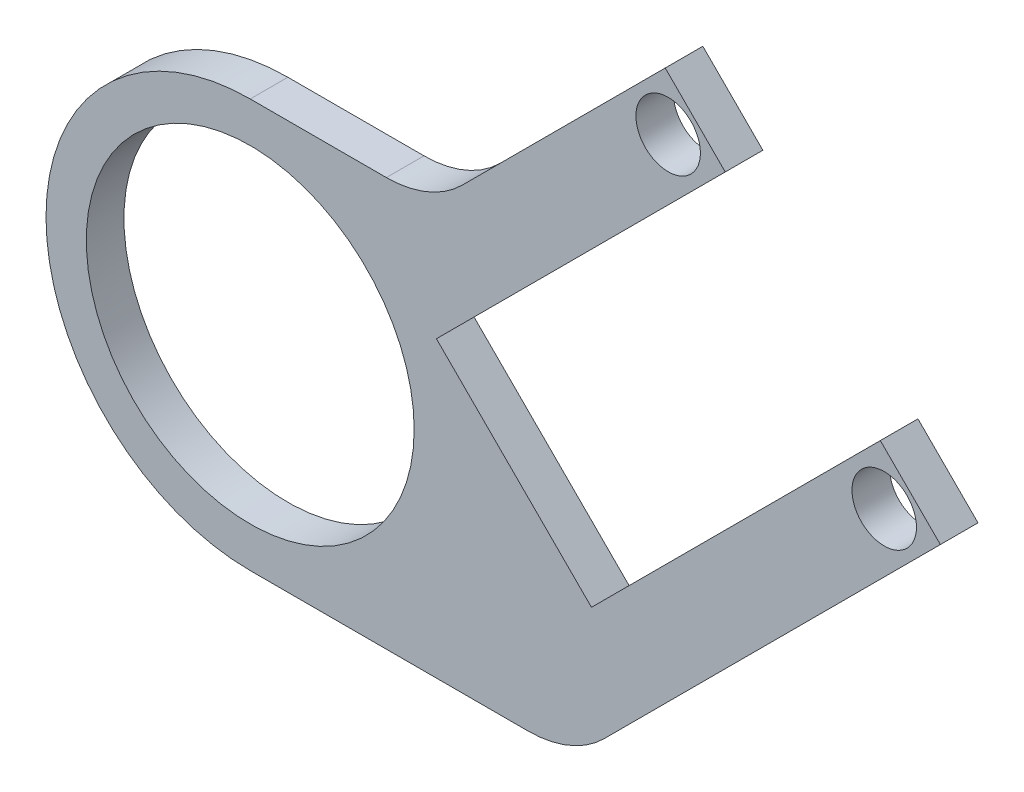
ISO-10303-21;
HEADER;
FILE_DESCRIPTION(('STEP AP214'),'2;1');
FILE_NAME('part.step','',(''),(''),'','','');
FILE_SCHEMA(('AUTOMOTIVE_DESIGN { 1 0 10303 214 1 1 1 1 }'));
ENDSEC;
DATA;
#1=APPLICATION_CONTEXT('core data for automotive mechanical design processes');
#2=APPLICATION_PROTOCOL_DEFINITION('international standard','automotive_design',2000,#1);
#3=PRODUCT_CONTEXT('',#1,'mechanical');
#4=PRODUCT('Part','Part','',(#3));
#5=PRODUCT_RELATED_PRODUCT_CATEGORY('part','',(#4));
#6=PRODUCT_DEFINITION_FORMATION('','',#4);
#7=PRODUCT_DEFINITION_CONTEXT('part definition',#1,'design');
#8=PRODUCT_DEFINITION('design','',#6,#7);
#9=PRODUCT_DEFINITION_SHAPE('','',#8);
#10=(LENGTH_UNIT() NAMED_UNIT(*) SI_UNIT(.MILLI.,.METRE.));
#11=(NAMED_UNIT(*) PLANE_ANGLE_UNIT() SI_UNIT($,.RADIAN.));
#12=(NAMED_UNIT(*) SI_UNIT($,.STERADIAN.) SOLID_ANGLE_UNIT());
#13=UNCERTAINTY_MEASURE_WITH_UNIT(LENGTH_MEASURE(1.E-05),#10,'distance_accuracy_value','');
#14=(GEOMETRIC_REPRESENTATION_CONTEXT(3) GLOBAL_UNCERTAINTY_ASSIGNED_CONTEXT((#13)) GLOBAL_UNIT_ASSIGNED_CONTEXT((#10,
#11,#12)) REPRESENTATION_CONTEXT('',''));
#15=CARTESIAN_POINT('',(0.,0.,0.));
#16=DIRECTION('',(0.,0.,1.));
#17=DIRECTION('',(1.,0.,0.));
#18=AXIS2_PLACEMENT_3D('',#15,#16,#17);
#19=CARTESIAN_POINT('',(0.,0.,3.5));
#20=DIRECTION('',(0.,0.,1.));
#21=DIRECTION('',(1.,0.,0.));
#22=AXIS2_PLACEMENT_3D('',#19,#20,#21);
#23=PLANE('',#22);
#24=CARTESIAN_POINT('',(58.9776159145091,15.4753711382337,3.5));
#25=DIRECTION('',(0.,0.,1.));
#26=DIRECTION('',(1.,0.,0.));
#27=AXIS2_PLACEMENT_3D('',#24,#25,#26);
#28=CIRCLE('',#27,3.);
#29=CARTESIAN_POINT('',(61.9776159145091,15.4753711382337,3.5));
#30=VERTEX_POINT('',#29);
#31=EDGE_CURVE('E289',#30,#30,#28,.T.);
#32=ORIENTED_EDGE('',*,*,#31,.F.);
#33=EDGE_LOOP('',(#32));
#34=FACE_BOUND('',#33,.T.);
#35=CARTESIAN_POINT('',(38.8781056592815,35.5748813934614,3.5));
#36=DIRECTION('',(0.,0.,1.));
#37=DIRECTION('',(1.,0.,0.));
#38=AXIS2_PLACEMENT_3D('',#35,#36,#37);
#39=CIRCLE('',#38,3.);
#40=CARTESIAN_POINT('',(41.8781056592815,35.5748813934614,3.5));
#41=VERTEX_POINT('',#40);
#42=EDGE_CURVE('E291',#41,#41,#39,.T.);
#43=ORIENTED_EDGE('',*,*,#42,.F.);
#44=EDGE_LOOP('',(#43));
#45=FACE_BOUND('',#44,.T.);
#46=CARTESIAN_POINT('',(0.,0.,3.5));
#47=DIRECTION('',(0.,0.,1.));
#48=DIRECTION('',(1.,0.,0.));
#49=AXIS2_PLACEMENT_3D('',#46,#47,#48);
#50=CIRCLE('',#49,15.25);
#51=CARTESIAN_POINT('',(15.25,0.,3.5));
#52=VERTEX_POINT('',#51);
#53=EDGE_CURVE('E297',#52,#52,#50,.T.);
#54=ORIENTED_EDGE('',*,*,#53,.F.);
#55=EDGE_LOOP('',(#54));
#56=FACE_BOUND('',#55,.T.);
#57=DIRECTION('',(1.,0.,0.));
#58=VECTOR('',#57,1.);
#59=CARTESIAN_POINT('',(0.,-19.,3.5));
#60=LINE('',#59,#58);
#61=CARTESIAN_POINT('',(0.,-19.,3.5));
#62=VERTEX_POINT('',#61);
#63=CARTESIAN_POINT('',(25.857864376269,-18.9999999999997,3.5));
#64=VERTEX_POINT('',#63);
#65=EDGE_CURVE('E189',#62,#64,#60,.T.);
#66=ORIENTED_EDGE('',*,*,#65,.T.);
#67=CARTESIAN_POINT('',(25.8578643762689,-8.99999999999968,3.5));
#68=DIRECTION('',(0.,0.,1.));
#69=DIRECTION('',(1.,0.,0.));
#70=AXIS2_PLACEMENT_3D('',#67,#68,#69);
#71=CIRCLE('',#70,10.);
#72=CARTESIAN_POINT('',(32.9289321881341,-16.0710678118654,3.5));
#73=VERTEX_POINT('',#72);
#74=EDGE_CURVE('E163',#64,#73,#71,.T.);
#75=ORIENTED_EDGE('',*,*,#74,.T.);
#76=DIRECTION('',(0.707106781186574,0.707106781186521,0.));
#77=VECTOR('',#76,1.);
#78=CARTESIAN_POINT('',(29.9999999999996,-18.9999999999996,3.5));
#79=LINE('',#78,#77);
#80=CARTESIAN_POINT('',(64.2013672605249,15.201367260523,3.5));
#81=VERTEX_POINT('',#80);
#82=EDGE_CURVE('E194',#73,#81,#79,.T.);
#83=ORIENTED_EDGE('',*,*,#82,.T.);
#84=DIRECTION('',(-0.707106781186531,0.707106781186563,0.));
#85=VECTOR('',#84,1.);
#86=CARTESIAN_POINT('',(64.2013672605249,15.201367260523,3.5));
#87=LINE('',#86,#85);
#88=CARTESIAN_POINT('',(58.6152236891513,20.7875108318968,3.5));
#89=VERTEX_POINT('',#88);
#90=EDGE_CURVE('E196',#81,#89,#87,.T.);
#91=ORIENTED_EDGE('',*,*,#90,.T.);
#92=DIRECTION('',(-0.707106781186562,-0.707106781186533,0.));
#93=VECTOR('',#92,1.);
#94=CARTESIAN_POINT('',(31.745166004062,-6.08254685319135,3.5));
#95=LINE('',#94,#93);
#96=CARTESIAN_POINT('',(31.745166004062,-6.08254685319135,3.5));
#97=VERTEX_POINT('',#96);
#98=EDGE_CURVE('E198',#89,#97,#95,.T.);
#99=ORIENTED_EDGE('',*,*,#98,.T.);
#100=DIRECTION('',(-0.707106781186544,0.707106781186551,0.));
#101=VECTOR('',#100,1.);
#102=CARTESIAN_POINT('',(17.3201876678565,8.34243148301427,3.5));
#103=LINE('',#102,#101);
#104=CARTESIAN_POINT('',(17.3201876678565,8.34243148301427,3.5));
#105=VERTEX_POINT('',#104);
#106=EDGE_CURVE('E139',#97,#105,#103,.T.);
#107=ORIENTED_EDGE('',*,*,#106,.T.);
#108=DIRECTION('',(0.707106781186562,0.707106781186533,0.));
#109=VECTOR('',#108,1.);
#110=CARTESIAN_POINT('',(17.3201876678565,8.34243148301427,3.5));
#111=LINE('',#110,#109);
#112=CARTESIAN_POINT('',(44.190245352946,35.2124891681027,3.5));
#113=VERTEX_POINT('',#112);
#114=EDGE_CURVE('E135',#105,#113,#111,.T.);
#115=ORIENTED_EDGE('',*,*,#114,.T.);
#116=DIRECTION('',(-0.707106781186533,0.707106781186562,0.));
#117=VECTOR('',#116,1.);
#118=CARTESIAN_POINT('',(44.190245352946,35.2124891681027,3.5));
#119=LINE('',#118,#117);
#120=CARTESIAN_POINT('',(38.6041017815724,40.7986327394765,3.5));
#121=VERTEX_POINT('',#120);
#122=EDGE_CURVE('E123',#113,#121,#119,.T.);
#123=ORIENTED_EDGE('',*,*,#122,.T.);
#124=DIRECTION('',(-0.707106781186543,-0.707106781186552,0.));
#125=VECTOR('',#124,1.);
#126=CARTESIAN_POINT('',(38.6041017815724,40.7986327394765,3.5));
#127=LINE('',#126,#125);
#128=CARTESIAN_POINT('',(19.7344012302307,21.9289321881346,3.5));
#129=VERTEX_POINT('',#128);
#130=EDGE_CURVE('E134',#121,#129,#127,.T.);
#131=ORIENTED_EDGE('',*,*,#130,.T.);
#132=CARTESIAN_POINT('',(12.6633334183652,29.,3.5));
#133=DIRECTION('',(0.,0.,1.));
#134=DIRECTION('',(1.,0.,0.));
#135=AXIS2_PLACEMENT_3D('',#132,#133,#134);
#136=CIRCLE('',#135,10.);
#137=CARTESIAN_POINT('',(12.6633334183652,19.,3.5));
#138=VERTEX_POINT('',#137);
#139=EDGE_CURVE('E11',#129,#138,#136,.F.);
#140=ORIENTED_EDGE('',*,*,#139,.T.);
#141=DIRECTION('',(-1.,0.,0.));
#142=VECTOR('',#141,1.);
#143=CARTESIAN_POINT('',(16.8054690420962,19.,3.5));
#144=LINE('',#143,#142);
#145=CARTESIAN_POINT('',(0.,19.,3.5));
#146=VERTEX_POINT('',#145);
#147=EDGE_CURVE('E181',#138,#146,#144,.T.);
#148=ORIENTED_EDGE('',*,*,#147,.T.);
#149=CARTESIAN_POINT('',(0.,0.,3.5));
#150=DIRECTION('',(0.,0.,1.));
#151=DIRECTION('',(1.,0.,0.));
#152=AXIS2_PLACEMENT_3D('',#149,#150,#151);
#153=CIRCLE('',#152,19.);
#154=EDGE_CURVE('E187',#146,#62,#153,.T.);
#155=ORIENTED_EDGE('',*,*,#154,.T.);
#156=EDGE_LOOP('',(#66,#75,#83,#91,#99,#107,#115,#123,#131,#140,#148,#155));
#157=FACE_BOUND('',#156,.T.);
#158=ADVANCED_FACE('F33',(#34,#45,#56,#157),#23,.T.);
#159=CARTESIAN_POINT('',(0.,0.,0.));
#160=DIRECTION('',(0.,0.,1.));
#161=DIRECTION('',(1.,0.,0.));
#162=AXIS2_PLACEMENT_3D('',#159,#160,#161);
#163=PLANE('',#162);
#164=CARTESIAN_POINT('',(58.9776159145091,15.4753711382337,0.));
#165=DIRECTION('',(0.,0.,1.));
#166=DIRECTION('',(1.,0.,0.));
#167=AXIS2_PLACEMENT_3D('',#164,#165,#166);
#168=CIRCLE('',#167,3.);
#169=CARTESIAN_POINT('',(61.9776159145091,15.4753711382337,0.));
#170=VERTEX_POINT('',#169);
#171=EDGE_CURVE('E287',#170,#170,#168,.T.);
#172=ORIENTED_EDGE('',*,*,#171,.T.);
#173=EDGE_LOOP('',(#172));
#174=FACE_BOUND('',#173,.T.);
#175=CARTESIAN_POINT('',(38.8781056592815,35.5748813934614,0.));
#176=DIRECTION('',(0.,0.,1.));
#177=DIRECTION('',(1.,0.,0.));
#178=AXIS2_PLACEMENT_3D('',#175,#176,#177);
#179=CIRCLE('',#178,3.);
#180=CARTESIAN_POINT('',(41.8781056592815,35.5748813934614,0.));
#181=VERTEX_POINT('',#180);
#182=EDGE_CURVE('E294',#181,#181,#179,.T.);
#183=ORIENTED_EDGE('',*,*,#182,.T.);
#184=EDGE_LOOP('',(#183));
#185=FACE_BOUND('',#184,.T.);
#186=CARTESIAN_POINT('',(0.,0.,0.));
#187=DIRECTION('',(0.,0.,1.));
#188=DIRECTION('',(1.,0.,0.));
#189=AXIS2_PLACEMENT_3D('',#186,#187,#188);
#190=CIRCLE('',#189,15.25);
#191=CARTESIAN_POINT('',(15.25,0.,0.));
#192=VERTEX_POINT('',#191);
#193=EDGE_CURVE('E203',#192,#192,#190,.T.);
#194=ORIENTED_EDGE('',*,*,#193,.T.);
#195=EDGE_LOOP('',(#194));
#196=FACE_BOUND('',#195,.T.);
#197=DIRECTION('',(0.707106781186574,0.707106781186521,0.));
#198=VECTOR('',#197,1.);
#199=CARTESIAN_POINT('',(29.9999999999996,-18.9999999999996,0.));
#200=LINE('',#199,#198);
#201=CARTESIAN_POINT('',(32.9289321881341,-16.0710678118654,0.));
#202=VERTEX_POINT('',#201);
#203=CARTESIAN_POINT('',(64.2013672605249,15.201367260523,0.));
#204=VERTEX_POINT('',#203);
#205=EDGE_CURVE('E210',#202,#204,#200,.T.);
#206=ORIENTED_EDGE('',*,*,#205,.F.);
#207=CARTESIAN_POINT('',(25.8578643762689,-8.99999999999968,0.));
#208=DIRECTION('',(0.,0.,1.));
#209=DIRECTION('',(1.,0.,0.));
#210=AXIS2_PLACEMENT_3D('',#207,#208,#209);
#211=CIRCLE('',#210,10.);
#212=CARTESIAN_POINT('',(25.857864376269,-18.9999999999997,0.));
#213=VERTEX_POINT('',#212);
#214=EDGE_CURVE('E56',#202,#213,#211,.F.);
#215=ORIENTED_EDGE('',*,*,#214,.T.);
#216=DIRECTION('',(1.,0.,0.));
#217=VECTOR('',#216,1.);
#218=CARTESIAN_POINT('',(0.,-19.,0.));
#219=LINE('',#218,#217);
#220=CARTESIAN_POINT('',(0.,-19.,0.));
#221=VERTEX_POINT('',#220);
#222=EDGE_CURVE('E208',#221,#213,#219,.T.);
#223=ORIENTED_EDGE('',*,*,#222,.F.);
#224=CARTESIAN_POINT('',(0.,0.,0.));
#225=DIRECTION('',(0.,0.,1.));
#226=DIRECTION('',(1.,0.,0.));
#227=AXIS2_PLACEMENT_3D('',#224,#225,#226);
#228=CIRCLE('',#227,19.);
#229=CARTESIAN_POINT('',(0.,19.,0.));
#230=VERTEX_POINT('',#229);
#231=EDGE_CURVE('E206',#230,#221,#228,.T.);
#232=ORIENTED_EDGE('',*,*,#231,.F.);
#233=DIRECTION('',(-1.,0.,0.));
#234=VECTOR('',#233,1.);
#235=CARTESIAN_POINT('',(16.8054690420962,19.,0.));
#236=LINE('',#235,#234);
#237=CARTESIAN_POINT('',(12.6633334183652,19.,0.));
#238=VERTEX_POINT('',#237);
#239=EDGE_CURVE('E170',#238,#230,#236,.T.);
#240=ORIENTED_EDGE('',*,*,#239,.F.);
#241=CARTESIAN_POINT('',(12.6633334183652,29.,0.));
#242=DIRECTION('',(0.,0.,1.));
#243=DIRECTION('',(1.,0.,0.));
#244=AXIS2_PLACEMENT_3D('',#241,#242,#243);
#245=CIRCLE('',#244,10.);
#246=CARTESIAN_POINT('',(19.7344012302307,21.9289321881346,0.));
#247=VERTEX_POINT('',#246);
#248=EDGE_CURVE('E41',#238,#247,#245,.T.);
#249=ORIENTED_EDGE('',*,*,#248,.T.);
#250=DIRECTION('',(-0.707106781186543,-0.707106781186552,0.));
#251=VECTOR('',#250,1.);
#252=CARTESIAN_POINT('',(38.6041017815724,40.7986327394765,0.));
#253=LINE('',#252,#251);
#254=CARTESIAN_POINT('',(38.6041017815724,40.7986327394765,0.));
#255=VERTEX_POINT('',#254);
#256=EDGE_CURVE('E168',#255,#247,#253,.T.);
#257=ORIENTED_EDGE('',*,*,#256,.F.);
#258=DIRECTION('',(-0.707106781186533,0.707106781186562,0.));
#259=VECTOR('',#258,1.);
#260=CARTESIAN_POINT('',(44.190245352946,35.2124891681027,0.));
#261=LINE('',#260,#259);
#262=CARTESIAN_POINT('',(44.190245352946,35.2124891681027,0.));
#263=VERTEX_POINT('',#262);
#264=EDGE_CURVE('E176',#263,#255,#261,.T.);
#265=ORIENTED_EDGE('',*,*,#264,.F.);
#266=DIRECTION('',(0.707106781186562,0.707106781186533,0.));
#267=VECTOR('',#266,1.);
#268=CARTESIAN_POINT('',(17.3201876678565,8.34243148301427,0.));
#269=LINE('',#268,#267);
#270=CARTESIAN_POINT('',(17.3201876678565,8.34243148301427,0.));
#271=VERTEX_POINT('',#270);
#272=EDGE_CURVE('E147',#271,#263,#269,.T.);
#273=ORIENTED_EDGE('',*,*,#272,.F.);
#274=DIRECTION('',(-0.707106781186544,0.707106781186551,0.));
#275=VECTOR('',#274,1.);
#276=CARTESIAN_POINT('',(17.3201876678565,8.34243148301427,0.));
#277=LINE('',#276,#275);
#278=CARTESIAN_POINT('',(31.745166004062,-6.08254685319135,0.));
#279=VERTEX_POINT('',#278);
#280=EDGE_CURVE('E143',#279,#271,#277,.T.);
#281=ORIENTED_EDGE('',*,*,#280,.F.);
#282=DIRECTION('',(-0.707106781186562,-0.707106781186533,0.));
#283=VECTOR('',#282,1.);
#284=CARTESIAN_POINT('',(31.745166004062,-6.08254685319135,0.));
#285=LINE('',#284,#283);
#286=CARTESIAN_POINT('',(58.6152236891513,20.7875108318968,0.));
#287=VERTEX_POINT('',#286);
#288=EDGE_CURVE('E214',#287,#279,#285,.T.);
#289=ORIENTED_EDGE('',*,*,#288,.F.);
#290=DIRECTION('',(-0.707106781186531,0.707106781186563,0.));
#291=VECTOR('',#290,1.);
#292=CARTESIAN_POINT('',(64.2013672605249,15.201367260523,0.));
#293=LINE('',#292,#291);
#294=EDGE_CURVE('E212',#204,#287,#293,.T.);
#295=ORIENTED_EDGE('',*,*,#294,.F.);
#296=EDGE_LOOP('',(#206,#215,#223,#232,#240,#249,#257,#265,#273,#281,#289,#295));
#297=FACE_BOUND('',#296,.T.);
#298=ADVANCED_FACE('F167',(#174,#185,#196,#297),#163,.F.);
#299=CARTESIAN_POINT('',(17.3201876678565,8.34243148301427,3.5));
#300=DIRECTION('',(-0.707106781186533,0.707106781186563,0.));
#301=DIRECTION('',(-0.707106781186562,-0.707106781186533,0.));
#302=AXIS2_PLACEMENT_3D('',#299,#300,#301);
#303=PLANE('',#302);
#304=ORIENTED_EDGE('',*,*,#272,.T.);
#305=DIRECTION('',(0.,0.,-1.));
#306=VECTOR('',#305,1.);
#307=CARTESIAN_POINT('',(44.190245352946,35.2124891681027,3.5));
#308=LINE('',#307,#306);
#309=EDGE_CURVE('E127',#113,#263,#308,.T.);
#310=ORIENTED_EDGE('',*,*,#309,.F.);
#311=ORIENTED_EDGE('',*,*,#114,.F.);
#312=DIRECTION('',(0.,0.,-1.));
#313=VECTOR('',#312,1.);
#314=CARTESIAN_POINT('',(17.3201876678565,8.34243148301427,3.5));
#315=LINE('',#314,#313);
#316=EDGE_CURVE('E201',#105,#271,#315,.T.);
#317=ORIENTED_EDGE('',*,*,#316,.T.);
#318=EDGE_LOOP('',(#304,#310,#311,#317));
#319=FACE_BOUND('',#318,.T.);
#320=ADVANCED_FACE('F145',(#319),#303,.F.);
#321=CARTESIAN_POINT('',(44.190245352946,35.2124891681027,3.5));
#322=DIRECTION('',(-0.707106781186562,-0.707106781186533,0.));
#323=DIRECTION('',(0.707106781186533,-0.707106781186562,0.));
#324=AXIS2_PLACEMENT_3D('',#321,#322,#323);
#325=PLANE('',#324);
#326=ORIENTED_EDGE('',*,*,#264,.T.);
#327=DIRECTION('',(0.,0.,-1.));
#328=VECTOR('',#327,1.);
#329=CARTESIAN_POINT('',(38.6041017815724,40.7986327394765,3.5));
#330=LINE('',#329,#328);
#331=EDGE_CURVE('E130',#121,#255,#330,.T.);
#332=ORIENTED_EDGE('',*,*,#331,.F.);
#333=ORIENTED_EDGE('',*,*,#122,.F.);
#334=ORIENTED_EDGE('',*,*,#309,.T.);
#335=EDGE_LOOP('',(#326,#332,#333,#334));
#336=FACE_BOUND('',#335,.T.);
#337=ADVANCED_FACE('F125',(#336),#325,.F.);
#338=CARTESIAN_POINT('',(38.6041017815724,40.7986327394765,3.5));
#339=DIRECTION('',(0.707106781186552,-0.707106781186543,0.));
#340=DIRECTION('',(0.707106781186543,0.707106781186552,0.));
#341=AXIS2_PLACEMENT_3D('',#338,#339,#340);
#342=PLANE('',#341);
#343=ORIENTED_EDGE('',*,*,#256,.T.);
#344=DIRECTION('',(0.,0.,-1.));
#345=VECTOR('',#344,1.);
#346=CARTESIAN_POINT('',(19.7344012302307,21.9289321881346,3.5));
#347=LINE('',#346,#345);
#348=EDGE_CURVE('E151',#247,#129,#347,.F.);
#349=ORIENTED_EDGE('',*,*,#348,.T.);
#350=ORIENTED_EDGE('',*,*,#130,.F.);
#351=ORIENTED_EDGE('',*,*,#331,.T.);
#352=EDGE_LOOP('',(#343,#349,#350,#351));
#353=FACE_BOUND('',#352,.T.);
#354=ADVANCED_FACE('F175',(#353),#342,.F.);
#355=CARTESIAN_POINT('',(16.8054690420962,19.,3.5));
#356=DIRECTION('',(0.,-1.,0.));
#357=DIRECTION('',(0.,0.,-1.));
#358=AXIS2_PLACEMENT_3D('',#355,#356,#357);
#359=PLANE('',#358);
#360=ORIENTED_EDGE('',*,*,#147,.F.);
#361=DIRECTION('',(0.,0.,-1.));
#362=VECTOR('',#361,1.);
#363=CARTESIAN_POINT('',(12.6633334183652,19.,0.));
#364=LINE('',#363,#362);
#365=EDGE_CURVE('E148',#138,#238,#364,.T.);
#366=ORIENTED_EDGE('',*,*,#365,.T.);
#367=ORIENTED_EDGE('',*,*,#239,.T.);
#368=DIRECTION('',(0.,0.,-1.));
#369=VECTOR('',#368,1.);
#370=CARTESIAN_POINT('',(0.,19.,3.5));
#371=LINE('',#370,#369);
#372=EDGE_CURVE('E153',#146,#230,#371,.T.);
#373=ORIENTED_EDGE('',*,*,#372,.F.);
#374=EDGE_LOOP('',(#360,#366,#367,#373));
#375=FACE_BOUND('',#374,.T.);
#376=ADVANCED_FACE('F184',(#375),#359,.F.);
#377=CARTESIAN_POINT('',(0.,0.,3.5));
#378=DIRECTION('',(0.,0.,-1.));
#379=DIRECTION('',(-1.,0.,0.));
#380=AXIS2_PLACEMENT_3D('',#377,#378,#379);
#381=CYLINDRICAL_SURFACE('',#380,19.);
#382=ORIENTED_EDGE('',*,*,#231,.T.);
#383=DIRECTION('',(0.,0.,-1.));
#384=VECTOR('',#383,1.);
#385=CARTESIAN_POINT('',(0.,-19.,3.5));
#386=LINE('',#385,#384);
#387=EDGE_CURVE('E227',#62,#221,#386,.T.);
#388=ORIENTED_EDGE('',*,*,#387,.F.);
#389=ORIENTED_EDGE('',*,*,#154,.F.);
#390=ORIENTED_EDGE('',*,*,#372,.T.);
#391=EDGE_LOOP('',(#382,#388,#389,#390));
#392=FACE_BOUND('',#391,.T.);
#393=ADVANCED_FACE('F230',(#392),#381,.T.);
#394=CARTESIAN_POINT('',(0.,-19.,3.5));
#395=DIRECTION('',(0.,1.,0.));
#396=DIRECTION('',(-1.,0.,0.));
#397=AXIS2_PLACEMENT_3D('',#394,#395,#396);
#398=PLANE('',#397);
#399=ORIENTED_EDGE('',*,*,#222,.T.);
#400=DIRECTION('',(0.,0.,-1.));
#401=VECTOR('',#400,1.);
#402=CARTESIAN_POINT('',(25.857864376269,-18.9999999999997,3.5));
#403=LINE('',#402,#401);
#404=EDGE_CURVE('E48',#213,#64,#403,.F.);
#405=ORIENTED_EDGE('',*,*,#404,.T.);
#406=ORIENTED_EDGE('',*,*,#65,.F.);
#407=ORIENTED_EDGE('',*,*,#387,.T.);
#408=EDGE_LOOP('',(#399,#405,#406,#407));
#409=FACE_BOUND('',#408,.T.);
#410=ADVANCED_FACE('F232',(#409),#398,.F.);
#411=CARTESIAN_POINT('',(29.9999999999996,-18.9999999999996,3.5));
#412=DIRECTION('',(-0.707106781186521,0.707106781186574,0.));
#413=DIRECTION('',(-0.707106781186574,-0.707106781186521,0.));
#414=AXIS2_PLACEMENT_3D('',#411,#412,#413);
#415=PLANE('',#414);
#416=ORIENTED_EDGE('',*,*,#82,.F.);
#417=DIRECTION('',(0.,0.,-1.));
#418=VECTOR('',#417,1.);
#419=CARTESIAN_POINT('',(32.9289321881341,-16.0710678118654,3.5));
#420=LINE('',#419,#418);
#421=EDGE_CURVE('E158',#73,#202,#420,.T.);
#422=ORIENTED_EDGE('',*,*,#421,.T.);
#423=ORIENTED_EDGE('',*,*,#205,.T.);
#424=DIRECTION('',(0.,0.,-1.));
#425=VECTOR('',#424,1.);
#426=CARTESIAN_POINT('',(64.2013672605249,15.201367260523,3.5));
#427=LINE('',#426,#425);
#428=EDGE_CURVE('E224',#81,#204,#427,.T.);
#429=ORIENTED_EDGE('',*,*,#428,.F.);
#430=EDGE_LOOP('',(#416,#422,#423,#429));
#431=FACE_BOUND('',#430,.T.);
#432=ADVANCED_FACE('F239',(#431),#415,.F.);
#433=CARTESIAN_POINT('',(64.2013672605249,15.201367260523,3.5));
#434=DIRECTION('',(-0.707106781186563,-0.707106781186531,0.));
#435=DIRECTION('',(0.707106781186531,-0.707106781186564,0.));
#436=AXIS2_PLACEMENT_3D('',#433,#434,#435);
#437=PLANE('',#436);
#438=ORIENTED_EDGE('',*,*,#294,.T.);
#439=DIRECTION('',(0.,0.,-1.));
#440=VECTOR('',#439,1.);
#441=CARTESIAN_POINT('',(58.6152236891513,20.7875108318968,3.5));
#442=LINE('',#441,#440);
#443=EDGE_CURVE('E221',#89,#287,#442,.T.);
#444=ORIENTED_EDGE('',*,*,#443,.F.);
#445=ORIENTED_EDGE('',*,*,#90,.F.);
#446=ORIENTED_EDGE('',*,*,#428,.T.);
#447=EDGE_LOOP('',(#438,#444,#445,#446));
#448=FACE_BOUND('',#447,.T.);
#449=ADVANCED_FACE('F244',(#448),#437,.F.);
#450=CARTESIAN_POINT('',(31.745166004062,-6.08254685319135,3.5));
#451=DIRECTION('',(0.707106781186533,-0.707106781186562,0.));
#452=DIRECTION('',(0.707106781186562,0.707106781186533,0.));
#453=AXIS2_PLACEMENT_3D('',#450,#451,#452);
#454=PLANE('',#453);
#455=ORIENTED_EDGE('',*,*,#288,.T.);
#456=DIRECTION('',(0.,0.,-1.));
#457=VECTOR('',#456,1.);
#458=CARTESIAN_POINT('',(31.745166004062,-6.08254685319135,3.5));
#459=LINE('',#458,#457);
#460=EDGE_CURVE('E218',#97,#279,#459,.T.);
#461=ORIENTED_EDGE('',*,*,#460,.F.);
#462=ORIENTED_EDGE('',*,*,#98,.F.);
#463=ORIENTED_EDGE('',*,*,#443,.T.);
#464=EDGE_LOOP('',(#455,#461,#462,#463));
#465=FACE_BOUND('',#464,.T.);
#466=ADVANCED_FACE('F248',(#465),#454,.F.);
#467=CARTESIAN_POINT('',(17.3201876678565,8.34243148301427,3.5));
#468=DIRECTION('',(-0.707106781186551,-0.707106781186544,0.));
#469=DIRECTION('',(0.707106781186544,-0.707106781186551,0.));
#470=AXIS2_PLACEMENT_3D('',#467,#468,#469);
#471=PLANE('',#470);
#472=ORIENTED_EDGE('',*,*,#280,.T.);
#473=ORIENTED_EDGE('',*,*,#316,.F.);
#474=ORIENTED_EDGE('',*,*,#106,.F.);
#475=ORIENTED_EDGE('',*,*,#460,.T.);
#476=EDGE_LOOP('',(#472,#473,#474,#475));
#477=FACE_BOUND('',#476,.T.);
#478=ADVANCED_FACE('F252',(#477),#471,.F.);
#479=CARTESIAN_POINT('',(12.6633334183652,29.,3.5));
#480=DIRECTION('',(0.,0.,1.));
#481=DIRECTION('',(1.,0.,0.));
#482=AXIS2_PLACEMENT_3D('',#479,#480,#481);
#483=CYLINDRICAL_SURFACE('',#482,10.);
#484=ORIENTED_EDGE('',*,*,#139,.F.);
#485=ORIENTED_EDGE('',*,*,#348,.F.);
#486=ORIENTED_EDGE('',*,*,#248,.F.);
#487=ORIENTED_EDGE('',*,*,#365,.F.);
#488=EDGE_LOOP('',(#484,#485,#486,#487));
#489=FACE_BOUND('',#488,.T.);
#490=ADVANCED_FACE('F179',(#489),#483,.F.);
#491=CARTESIAN_POINT('',(25.8578643762689,-8.99999999999968,3.5));
#492=DIRECTION('',(0.,0.,-1.));
#493=DIRECTION('',(-1.,0.,0.));
#494=AXIS2_PLACEMENT_3D('',#491,#492,#493);
#495=CYLINDRICAL_SURFACE('',#494,10.);
#496=ORIENTED_EDGE('',*,*,#74,.F.);
#497=ORIENTED_EDGE('',*,*,#404,.F.);
#498=ORIENTED_EDGE('',*,*,#214,.F.);
#499=ORIENTED_EDGE('',*,*,#421,.F.);
#500=EDGE_LOOP('',(#496,#497,#498,#499));
#501=FACE_BOUND('',#500,.T.);
#502=ADVANCED_FACE('F35',(#501),#495,.T.);
#503=CARTESIAN_POINT('',(0.,0.,0.));
#504=DIRECTION('',(0.,0.,1.));
#505=DIRECTION('',(1.,0.,0.));
#506=AXIS2_PLACEMENT_3D('',#503,#504,#505);
#507=CYLINDRICAL_SURFACE('',#506,15.25);
#508=ORIENTED_EDGE('',*,*,#193,.F.);
#509=EDGE_LOOP('',(#508));
#510=FACE_BOUND('',#509,.T.);
#511=ORIENTED_EDGE('',*,*,#53,.T.);
#512=EDGE_LOOP('',(#511));
#513=FACE_BOUND('',#512,.T.);
#514=ADVANCED_FACE('F271',(#510,#513),#507,.F.);
#515=CARTESIAN_POINT('',(38.8781056592815,35.5748813934614,0.));
#516=DIRECTION('',(0.,0.,1.));
#517=DIRECTION('',(1.,0.,0.));
#518=AXIS2_PLACEMENT_3D('',#515,#516,#517);
#519=CYLINDRICAL_SURFACE('',#518,3.);
#520=ORIENTED_EDGE('',*,*,#182,.F.);
#521=EDGE_LOOP('',(#520));
#522=FACE_BOUND('',#521,.T.);
#523=ORIENTED_EDGE('',*,*,#42,.T.);
#524=EDGE_LOOP('',(#523));
#525=FACE_BOUND('',#524,.T.);
#526=ADVANCED_FACE('F274',(#522,#525),#519,.F.);
#527=CARTESIAN_POINT('',(58.9776159145091,15.4753711382337,0.));
#528=DIRECTION('',(0.,0.,1.));
#529=DIRECTION('',(1.,0.,0.));
#530=AXIS2_PLACEMENT_3D('',#527,#528,#529);
#531=CYLINDRICAL_SURFACE('',#530,3.);
#532=ORIENTED_EDGE('',*,*,#171,.F.);
#533=EDGE_LOOP('',(#532));
#534=FACE_BOUND('',#533,.T.);
#535=ORIENTED_EDGE('',*,*,#31,.T.);
#536=EDGE_LOOP('',(#535));
#537=FACE_BOUND('',#536,.T.);
#538=ADVANCED_FACE('F278',(#534,#537),#531,.F.);
#539=CLOSED_SHELL('',(#158,#298,#320,#337,#354,#376,#393,#410,#432,#449,#466,#478,#490,#502,
#514,#526,#538));
#540=MANIFOLD_SOLID_BREP('B2',#539);
#541=ADVANCED_BREP_SHAPE_REPRESENTATION('',(#18,#540),#14);
#542=SHAPE_DEFINITION_REPRESENTATION(#9,#541);
ENDSEC;
END-ISO-10303-21;
